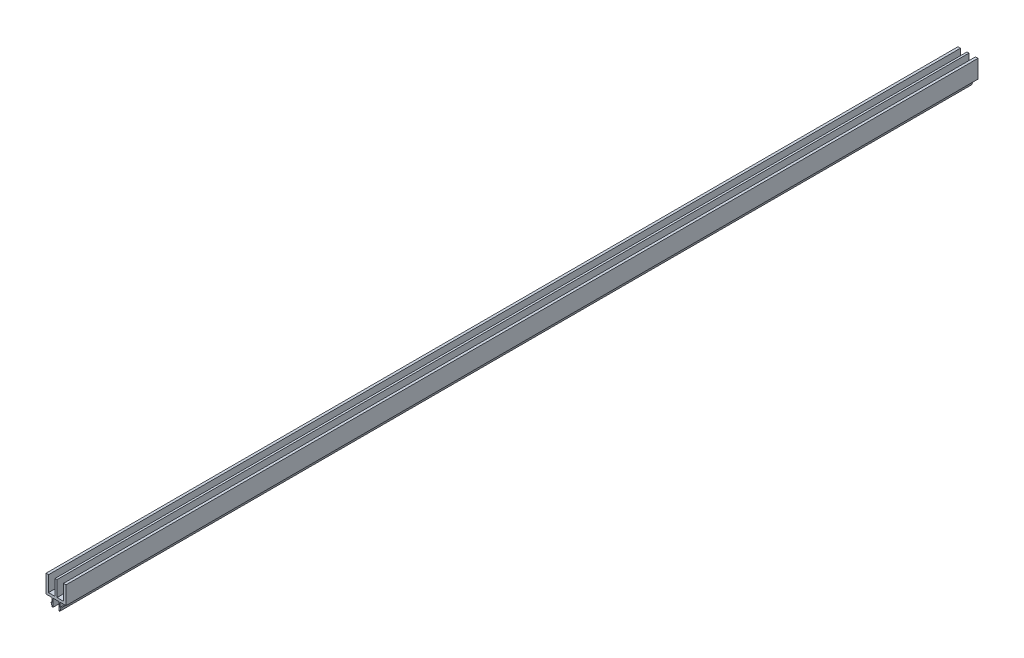
ISO-10303-21;
HEADER;
FILE_DESCRIPTION(('STEP AP214'),'2;1');
FILE_NAME('part.step','',(''),(''),'','','');
FILE_SCHEMA(('AUTOMOTIVE_DESIGN { 1 0 10303 214 1 1 1 1 }'));
ENDSEC;
DATA;
#1=APPLICATION_CONTEXT('core data for automotive mechanical design processes');
#2=APPLICATION_PROTOCOL_DEFINITION('international standard','automotive_design',2000,#1);
#3=PRODUCT_CONTEXT('',#1,'mechanical');
#4=PRODUCT('Part','Part','',(#3));
#5=PRODUCT_RELATED_PRODUCT_CATEGORY('part','',(#4));
#6=PRODUCT_DEFINITION_FORMATION('','',#4);
#7=PRODUCT_DEFINITION_CONTEXT('part definition',#1,'design');
#8=PRODUCT_DEFINITION('design','',#6,#7);
#9=PRODUCT_DEFINITION_SHAPE('','',#8);
#10=(LENGTH_UNIT() NAMED_UNIT(*) SI_UNIT(.MILLI.,.METRE.));
#11=(NAMED_UNIT(*) PLANE_ANGLE_UNIT() SI_UNIT($,.RADIAN.));
#12=(NAMED_UNIT(*) SI_UNIT($,.STERADIAN.) SOLID_ANGLE_UNIT());
#13=UNCERTAINTY_MEASURE_WITH_UNIT(LENGTH_MEASURE(1.E-05),#10,'distance_accuracy_value','');
#14=(GEOMETRIC_REPRESENTATION_CONTEXT(3) GLOBAL_UNCERTAINTY_ASSIGNED_CONTEXT((#13)) GLOBAL_UNIT_ASSIGNED_CONTEXT((#10,
#11,#12)) REPRESENTATION_CONTEXT('',''));
#15=CARTESIAN_POINT('',(0.,0.,0.));
#16=DIRECTION('',(0.,0.,1.));
#17=DIRECTION('',(1.,0.,0.));
#18=AXIS2_PLACEMENT_3D('',#15,#16,#17);
#19=CARTESIAN_POINT('',(-1.,17.9999999975,-860.));
#20=DIRECTION('',(-1.,0.,0.));
#21=DIRECTION('',(0.,-1.,0.));
#22=AXIS2_PLACEMENT_3D('',#19,#20,#21);
#23=PLANE('',#22);
#24=DIRECTION('',(0.,-1.,0.));
#25=VECTOR('',#24,1.);
#26=CARTESIAN_POINT('',(-1.,17.9999999975,50.));
#27=LINE('',#26,#25);
#28=CARTESIAN_POINT('',(-1.,17.9999999975,50.));
#29=VERTEX_POINT('',#28);
#30=CARTESIAN_POINT('',(-1.,2.4999999995,50.));
#31=VERTEX_POINT('',#30);
#32=EDGE_CURVE('E226',#29,#31,#27,.T.);
#33=ORIENTED_EDGE('',*,*,#32,.F.);
#34=DIRECTION('',(0.,0.,1.));
#35=VECTOR('',#34,1.);
#36=CARTESIAN_POINT('',(-1.,17.9999999975,-860.));
#37=LINE('',#36,#35);
#38=CARTESIAN_POINT('',(-1.,17.9999999975,-860.));
#39=VERTEX_POINT('',#38);
#40=EDGE_CURVE('E11',#39,#29,#37,.T.);
#41=ORIENTED_EDGE('',*,*,#40,.F.);
#42=DIRECTION('',(0.,-1.,0.));
#43=VECTOR('',#42,1.);
#44=CARTESIAN_POINT('',(-1.,17.9999999975,-860.));
#45=LINE('',#44,#43);
#46=CARTESIAN_POINT('',(-1.,2.4999999995,-860.));
#47=VERTEX_POINT('',#46);
#48=EDGE_CURVE('E294',#39,#47,#45,.T.);
#49=ORIENTED_EDGE('',*,*,#48,.T.);
#50=DIRECTION('',(0.,0.,1.));
#51=VECTOR('',#50,1.);
#52=CARTESIAN_POINT('',(-1.,2.4999999995,-860.));
#53=LINE('',#52,#51);
#54=EDGE_CURVE('E36',#47,#31,#53,.T.);
#55=ORIENTED_EDGE('',*,*,#54,.T.);
#56=EDGE_LOOP('',(#33,#41,#49,#55));
#57=FACE_BOUND('',#56,.T.);
#58=ADVANCED_FACE('F33',(#57),#23,.T.);
#59=CARTESIAN_POINT('',(0.999999999999998,17.9999999975,-860.));
#60=DIRECTION('',(0.,1.,0.));
#61=DIRECTION('',(0.,0.,1.));
#62=AXIS2_PLACEMENT_3D('',#59,#60,#61);
#63=PLANE('',#62);
#64=DIRECTION('',(-1.,0.,0.));
#65=VECTOR('',#64,1.);
#66=CARTESIAN_POINT('',(0.999999999999998,17.9999999975,50.));
#67=LINE('',#66,#65);
#68=CARTESIAN_POINT('',(0.999999999999998,17.9999999975,50.));
#69=VERTEX_POINT('',#68);
#70=EDGE_CURVE('E292',#69,#29,#67,.T.);
#71=ORIENTED_EDGE('',*,*,#70,.F.);
#72=DIRECTION('',(0.,0.,1.));
#73=VECTOR('',#72,1.);
#74=CARTESIAN_POINT('',(0.999999999999998,17.9999999975,-860.));
#75=LINE('',#74,#73);
#76=CARTESIAN_POINT('',(0.999999999999998,17.9999999975,-860.));
#77=VERTEX_POINT('',#76);
#78=EDGE_CURVE('E42',#77,#69,#75,.T.);
#79=ORIENTED_EDGE('',*,*,#78,.F.);
#80=DIRECTION('',(-1.,0.,0.));
#81=VECTOR('',#80,1.);
#82=CARTESIAN_POINT('',(0.999999999999998,17.9999999975,-860.));
#83=LINE('',#82,#81);
#84=EDGE_CURVE('E216',#77,#39,#83,.T.);
#85=ORIENTED_EDGE('',*,*,#84,.T.);
#86=ORIENTED_EDGE('',*,*,#40,.T.);
#87=EDGE_LOOP('',(#71,#79,#85,#86));
#88=FACE_BOUND('',#87,.T.);
#89=ADVANCED_FACE('F338',(#88),#63,.T.);
#90=CARTESIAN_POINT('',(0.999999999999998,2.4999999995,-860.));
#91=DIRECTION('',(1.,0.,0.));
#92=DIRECTION('',(0.,0.,-1.));
#93=AXIS2_PLACEMENT_3D('',#90,#91,#92);
#94=PLANE('',#93);
#95=DIRECTION('',(0.,1.,0.));
#96=VECTOR('',#95,1.);
#97=CARTESIAN_POINT('',(0.999999999999998,2.4999999995,50.));
#98=LINE('',#97,#96);
#99=CARTESIAN_POINT('',(0.999999999999998,2.4999999995,50.));
#100=VERTEX_POINT('',#99);
#101=EDGE_CURVE('E203',#100,#69,#98,.T.);
#102=ORIENTED_EDGE('',*,*,#101,.F.);
#103=DIRECTION('',(0.,0.,1.));
#104=VECTOR('',#103,1.);
#105=CARTESIAN_POINT('',(0.999999999999998,2.4999999995,-860.));
#106=LINE('',#105,#104);
#107=CARTESIAN_POINT('',(0.999999999999998,2.4999999995,-860.));
#108=VERTEX_POINT('',#107);
#109=EDGE_CURVE('E198',#108,#100,#106,.T.);
#110=ORIENTED_EDGE('',*,*,#109,.F.);
#111=DIRECTION('',(0.,1.,0.));
#112=VECTOR('',#111,1.);
#113=CARTESIAN_POINT('',(0.999999999999998,2.4999999995,-860.));
#114=LINE('',#113,#112);
#115=EDGE_CURVE('E201',#108,#77,#114,.T.);
#116=ORIENTED_EDGE('',*,*,#115,.T.);
#117=ORIENTED_EDGE('',*,*,#78,.T.);
#118=EDGE_LOOP('',(#102,#110,#116,#117));
#119=FACE_BOUND('',#118,.T.);
#120=ADVANCED_FACE('F200',(#119),#94,.T.);
#121=CARTESIAN_POINT('',(7.5,2.4999999995,-860.));
#122=DIRECTION('',(0.,1.,0.));
#123=DIRECTION('',(-1.,0.,0.));
#124=AXIS2_PLACEMENT_3D('',#121,#122,#123);
#125=PLANE('',#124);
#126=DIRECTION('',(-1.,0.,0.));
#127=VECTOR('',#126,1.);
#128=CARTESIAN_POINT('',(7.5,2.4999999995,50.));
#129=LINE('',#128,#127);
#130=CARTESIAN_POINT('',(7.5,2.4999999995,50.));
#131=VERTEX_POINT('',#130);
#132=EDGE_CURVE('E289',#131,#100,#129,.T.);
#133=ORIENTED_EDGE('',*,*,#132,.F.);
#134=DIRECTION('',(0.,0.,1.));
#135=VECTOR('',#134,1.);
#136=CARTESIAN_POINT('',(7.5,2.4999999995,-860.));
#137=LINE('',#136,#135);
#138=CARTESIAN_POINT('',(7.5,2.4999999995,-860.));
#139=VERTEX_POINT('',#138);
#140=EDGE_CURVE('E208',#139,#131,#137,.T.);
#141=ORIENTED_EDGE('',*,*,#140,.F.);
#142=DIRECTION('',(-1.,0.,0.));
#143=VECTOR('',#142,1.);
#144=CARTESIAN_POINT('',(7.5,2.4999999995,-860.));
#145=LINE('',#144,#143);
#146=EDGE_CURVE('E214',#139,#108,#145,.T.);
#147=ORIENTED_EDGE('',*,*,#146,.T.);
#148=ORIENTED_EDGE('',*,*,#109,.T.);
#149=EDGE_LOOP('',(#133,#141,#147,#148));
#150=FACE_BOUND('',#149,.T.);
#151=ADVANCED_FACE('F218',(#150),#125,.T.);
#152=CARTESIAN_POINT('',(7.5,17.9999999975,-860.));
#153=DIRECTION('',(-1.,0.,0.));
#154=DIRECTION('',(0.,-1.,0.));
#155=AXIS2_PLACEMENT_3D('',#152,#153,#154);
#156=PLANE('',#155);
#157=DIRECTION('',(0.,-1.,0.));
#158=VECTOR('',#157,1.);
#159=CARTESIAN_POINT('',(7.5,17.9999999975,50.));
#160=LINE('',#159,#158);
#161=CARTESIAN_POINT('',(7.5,17.9999999975,50.));
#162=VERTEX_POINT('',#161);
#163=EDGE_CURVE('E286',#162,#131,#160,.T.);
#164=ORIENTED_EDGE('',*,*,#163,.F.);
#165=DIRECTION('',(0.,0.,1.));
#166=VECTOR('',#165,1.);
#167=CARTESIAN_POINT('',(7.5,17.9999999975,-860.));
#168=LINE('',#167,#166);
#169=CARTESIAN_POINT('',(7.5,17.9999999975,-860.));
#170=VERTEX_POINT('',#169);
#171=EDGE_CURVE('E298',#170,#162,#168,.T.);
#172=ORIENTED_EDGE('',*,*,#171,.F.);
#173=DIRECTION('',(0.,-1.,0.));
#174=VECTOR('',#173,1.);
#175=CARTESIAN_POINT('',(7.5,17.9999999975,-860.));
#176=LINE('',#175,#174);
#177=EDGE_CURVE('E219',#170,#139,#176,.T.);
#178=ORIENTED_EDGE('',*,*,#177,.T.);
#179=ORIENTED_EDGE('',*,*,#140,.T.);
#180=EDGE_LOOP('',(#164,#172,#178,#179));
#181=FACE_BOUND('',#180,.T.);
#182=ADVANCED_FACE('F351',(#181),#156,.T.);
#183=CARTESIAN_POINT('',(10.,17.9999999975,-860.));
#184=DIRECTION('',(0.,1.,0.));
#185=DIRECTION('',(0.,0.,1.));
#186=AXIS2_PLACEMENT_3D('',#183,#184,#185);
#187=PLANE('',#186);
#188=DIRECTION('',(-1.,0.,0.));
#189=VECTOR('',#188,1.);
#190=CARTESIAN_POINT('',(10.,17.9999999975,50.));
#191=LINE('',#190,#189);
#192=CARTESIAN_POINT('',(10.,17.9999999975,50.));
#193=VERTEX_POINT('',#192);
#194=EDGE_CURVE('E283',#193,#162,#191,.T.);
#195=ORIENTED_EDGE('',*,*,#194,.F.);
#196=DIRECTION('',(0.,0.,1.));
#197=VECTOR('',#196,1.);
#198=CARTESIAN_POINT('',(10.,17.9999999975,-860.));
#199=LINE('',#198,#197);
#200=CARTESIAN_POINT('',(10.,17.9999999975,-860.));
#201=VERTEX_POINT('',#200);
#202=EDGE_CURVE('E300',#201,#193,#199,.T.);
#203=ORIENTED_EDGE('',*,*,#202,.F.);
#204=DIRECTION('',(-1.,0.,0.));
#205=VECTOR('',#204,1.);
#206=CARTESIAN_POINT('',(10.,17.9999999975,-860.));
#207=LINE('',#206,#205);
#208=EDGE_CURVE('E221',#201,#170,#207,.T.);
#209=ORIENTED_EDGE('',*,*,#208,.T.);
#210=ORIENTED_EDGE('',*,*,#171,.T.);
#211=EDGE_LOOP('',(#195,#203,#209,#210));
#212=FACE_BOUND('',#211,.T.);
#213=ADVANCED_FACE('F354',(#212),#187,.T.);
#214=CARTESIAN_POINT('',(10.,-4.99999828349541E-10,-860.));
#215=DIRECTION('',(1.,0.,0.));
#216=DIRECTION('',(0.,0.,-1.));
#217=AXIS2_PLACEMENT_3D('',#214,#215,#216);
#218=PLANE('',#217);
#219=DIRECTION('',(0.,1.,0.));
#220=VECTOR('',#219,1.);
#221=CARTESIAN_POINT('',(10.,-4.99999828349541E-10,50.));
#222=LINE('',#221,#220);
#223=CARTESIAN_POINT('',(10.,-4.99999828349541E-10,50.));
#224=VERTEX_POINT('',#223);
#225=EDGE_CURVE('E280',#224,#193,#222,.T.);
#226=ORIENTED_EDGE('',*,*,#225,.F.);
#227=DIRECTION('',(0.,0.,1.));
#228=VECTOR('',#227,1.);
#229=CARTESIAN_POINT('',(10.,-4.99999828349541E-10,-860.));
#230=LINE('',#229,#228);
#231=CARTESIAN_POINT('',(10.,-4.99999828349541E-10,-860.));
#232=VERTEX_POINT('',#231);
#233=EDGE_CURVE('E302',#232,#224,#230,.T.);
#234=ORIENTED_EDGE('',*,*,#233,.F.);
#235=DIRECTION('',(0.,1.,0.));
#236=VECTOR('',#235,1.);
#237=CARTESIAN_POINT('',(10.,-4.99999828349541E-10,-860.));
#238=LINE('',#237,#236);
#239=EDGE_CURVE('E644',#232,#201,#238,.T.);
#240=ORIENTED_EDGE('',*,*,#239,.T.);
#241=ORIENTED_EDGE('',*,*,#202,.T.);
#242=EDGE_LOOP('',(#226,#234,#240,#241));
#243=FACE_BOUND('',#242,.T.);
#244=ADVANCED_FACE('F358',(#243),#218,.T.);
#245=CARTESIAN_POINT('',(4.,-4.99999998002099E-10,-860.));
#246=DIRECTION('',(0.,-1.,0.));
#247=DIRECTION('',(1.,0.,0.));
#248=AXIS2_PLACEMENT_3D('',#245,#246,#247);
#249=PLANE('',#248);
#250=DIRECTION('',(1.,0.,0.));
#251=VECTOR('',#250,1.);
#252=CARTESIAN_POINT('',(4.,-4.99999998002099E-10,50.));
#253=LINE('',#252,#251);
#254=CARTESIAN_POINT('',(4.,-4.99999998002099E-10,50.));
#255=VERTEX_POINT('',#254);
#256=EDGE_CURVE('E277',#255,#224,#253,.T.);
#257=ORIENTED_EDGE('',*,*,#256,.F.);
#258=DIRECTION('',(0.,0.,1.));
#259=VECTOR('',#258,1.);
#260=CARTESIAN_POINT('',(4.,-4.99999998002099E-10,-860.));
#261=LINE('',#260,#259);
#262=CARTESIAN_POINT('',(4.,-4.99999998002099E-10,-860.));
#263=VERTEX_POINT('',#262);
#264=EDGE_CURVE('E304',#263,#255,#261,.T.);
#265=ORIENTED_EDGE('',*,*,#264,.F.);
#266=DIRECTION('',(1.,0.,0.));
#267=VECTOR('',#266,1.);
#268=CARTESIAN_POINT('',(4.,-4.99999998002099E-10,-860.));
#269=LINE('',#268,#267);
#270=EDGE_CURVE('E648',#263,#232,#269,.T.);
#271=ORIENTED_EDGE('',*,*,#270,.T.);
#272=ORIENTED_EDGE('',*,*,#233,.T.);
#273=EDGE_LOOP('',(#257,#265,#271,#272));
#274=FACE_BOUND('',#273,.T.);
#275=ADVANCED_FACE('F362',(#274),#249,.T.);
#276=CARTESIAN_POINT('',(4.,-4.5,-860.));
#277=DIRECTION('',(1.,0.,0.));
#278=DIRECTION('',(0.,0.,-1.));
#279=AXIS2_PLACEMENT_3D('',#276,#277,#278);
#280=PLANE('',#279);
#281=DIRECTION('',(0.,1.,0.));
#282=VECTOR('',#281,1.);
#283=CARTESIAN_POINT('',(4.,-4.5,50.));
#284=LINE('',#283,#282);
#285=CARTESIAN_POINT('',(4.,-4.5,50.));
#286=VERTEX_POINT('',#285);
#287=EDGE_CURVE('E274',#286,#255,#284,.T.);
#288=ORIENTED_EDGE('',*,*,#287,.F.);
#289=DIRECTION('',(0.,0.,1.));
#290=VECTOR('',#289,1.);
#291=CARTESIAN_POINT('',(4.,-4.5,-860.));
#292=LINE('',#291,#290);
#293=CARTESIAN_POINT('',(4.,-4.5,-860.));
#294=VERTEX_POINT('',#293);
#295=EDGE_CURVE('E306',#294,#286,#292,.T.);
#296=ORIENTED_EDGE('',*,*,#295,.F.);
#297=DIRECTION('',(0.,1.,0.));
#298=VECTOR('',#297,1.);
#299=CARTESIAN_POINT('',(4.,-4.5,-860.));
#300=LINE('',#299,#298);
#301=EDGE_CURVE('E637',#294,#263,#300,.T.);
#302=ORIENTED_EDGE('',*,*,#301,.T.);
#303=ORIENTED_EDGE('',*,*,#264,.T.);
#304=EDGE_LOOP('',(#288,#296,#302,#303));
#305=FACE_BOUND('',#304,.T.);
#306=ADVANCED_FACE('F366',(#305),#280,.T.);
#307=CARTESIAN_POINT('',(5.,-4.5,-860.));
#308=DIRECTION('',(0.,1.,0.));
#309=DIRECTION('',(0.,0.,1.));
#310=AXIS2_PLACEMENT_3D('',#307,#308,#309);
#311=PLANE('',#310);
#312=DIRECTION('',(-1.,0.,0.));
#313=VECTOR('',#312,1.);
#314=CARTESIAN_POINT('',(5.,-4.5,50.));
#315=LINE('',#314,#313);
#316=CARTESIAN_POINT('',(5.,-4.5,50.));
#317=VERTEX_POINT('',#316);
#318=EDGE_CURVE('E271',#317,#286,#315,.T.);
#319=ORIENTED_EDGE('',*,*,#318,.F.);
#320=DIRECTION('',(0.,0.,1.));
#321=VECTOR('',#320,1.);
#322=CARTESIAN_POINT('',(5.,-4.5,-860.));
#323=LINE('',#322,#321);
#324=CARTESIAN_POINT('',(5.,-4.5,-860.));
#325=VERTEX_POINT('',#324);
#326=EDGE_CURVE('E308',#325,#317,#323,.T.);
#327=ORIENTED_EDGE('',*,*,#326,.F.);
#328=DIRECTION('',(-1.,0.,0.));
#329=VECTOR('',#328,1.);
#330=CARTESIAN_POINT('',(5.,-4.5,-860.));
#331=LINE('',#330,#329);
#332=EDGE_CURVE('E633',#325,#294,#331,.T.);
#333=ORIENTED_EDGE('',*,*,#332,.T.);
#334=ORIENTED_EDGE('',*,*,#295,.T.);
#335=EDGE_LOOP('',(#319,#327,#333,#334));
#336=FACE_BOUND('',#335,.T.);
#337=ADVANCED_FACE('F370',(#336),#311,.T.);
#338=CARTESIAN_POINT('',(3.75,-8.,-860.));
#339=DIRECTION('',(0.941741911594837,-0.336336396998156,0.));
#340=DIRECTION('',(0.336336396998157,0.941741911594838,0.));
#341=AXIS2_PLACEMENT_3D('',#338,#339,#340);
#342=PLANE('',#341);
#343=DIRECTION('',(0.336336396998157,0.941741911594837,0.));
#344=VECTOR('',#343,1.);
#345=CARTESIAN_POINT('',(3.75,-8.,50.));
#346=LINE('',#345,#344);
#347=CARTESIAN_POINT('',(3.75,-8.,50.));
#348=VERTEX_POINT('',#347);
#349=EDGE_CURVE('E268',#348,#317,#346,.T.);
#350=ORIENTED_EDGE('',*,*,#349,.F.);
#351=DIRECTION('',(0.,0.,1.));
#352=VECTOR('',#351,1.);
#353=CARTESIAN_POINT('',(3.75,-8.,-860.));
#354=LINE('',#353,#352);
#355=CARTESIAN_POINT('',(3.75,-8.,-860.));
#356=VERTEX_POINT('',#355);
#357=EDGE_CURVE('E310',#356,#348,#354,.T.);
#358=ORIENTED_EDGE('',*,*,#357,.F.);
#359=DIRECTION('',(0.336336396998157,0.941741911594837,0.));
#360=VECTOR('',#359,1.);
#361=CARTESIAN_POINT('',(3.75,-8.,-860.));
#362=LINE('',#361,#360);
#363=EDGE_CURVE('E654',#356,#325,#362,.T.);
#364=ORIENTED_EDGE('',*,*,#363,.T.);
#365=ORIENTED_EDGE('',*,*,#326,.T.);
#366=EDGE_LOOP('',(#350,#358,#364,#365));
#367=FACE_BOUND('',#366,.T.);
#368=ADVANCED_FACE('F374',(#367),#342,.T.);
#369=CARTESIAN_POINT('',(3.,-8.,-860.));
#370=DIRECTION('',(0.,-1.,0.));
#371=DIRECTION('',(0.,0.,-1.));
#372=AXIS2_PLACEMENT_3D('',#369,#370,#371);
#373=PLANE('',#372);
#374=DIRECTION('',(1.,0.,0.));
#375=VECTOR('',#374,1.);
#376=CARTESIAN_POINT('',(3.,-8.,50.));
#377=LINE('',#376,#375);
#378=CARTESIAN_POINT('',(3.,-8.,50.));
#379=VERTEX_POINT('',#378);
#380=EDGE_CURVE('E265',#379,#348,#377,.T.);
#381=ORIENTED_EDGE('',*,*,#380,.F.);
#382=DIRECTION('',(0.,0.,1.));
#383=VECTOR('',#382,1.);
#384=CARTESIAN_POINT('',(3.,-8.,-860.));
#385=LINE('',#384,#383);
#386=CARTESIAN_POINT('',(3.,-8.,-860.));
#387=VERTEX_POINT('',#386);
#388=EDGE_CURVE('E312',#387,#379,#385,.T.);
#389=ORIENTED_EDGE('',*,*,#388,.F.);
#390=DIRECTION('',(1.,0.,0.));
#391=VECTOR('',#390,1.);
#392=CARTESIAN_POINT('',(3.,-8.,-860.));
#393=LINE('',#392,#391);
#394=EDGE_CURVE('E626',#387,#356,#393,.T.);
#395=ORIENTED_EDGE('',*,*,#394,.T.);
#396=ORIENTED_EDGE('',*,*,#357,.T.);
#397=EDGE_LOOP('',(#381,#389,#395,#396));
#398=FACE_BOUND('',#397,.T.);
#399=ADVANCED_FACE('F378',(#398),#373,.T.);
#400=CARTESIAN_POINT('',(3.,-4.9999985194348E-10,-860.));
#401=DIRECTION('',(-1.,0.,0.));
#402=DIRECTION('',(0.,0.,1.));
#403=AXIS2_PLACEMENT_3D('',#400,#401,#402);
#404=PLANE('',#403);
#405=DIRECTION('',(0.,-1.,0.));
#406=VECTOR('',#405,1.);
#407=CARTESIAN_POINT('',(3.,-4.9999985194348E-10,50.));
#408=LINE('',#407,#406);
#409=CARTESIAN_POINT('',(3.,-4.9999985194348E-10,50.));
#410=VERTEX_POINT('',#409);
#411=EDGE_CURVE('E262',#410,#379,#408,.T.);
#412=ORIENTED_EDGE('',*,*,#411,.F.);
#413=DIRECTION('',(0.,0.,1.));
#414=VECTOR('',#413,1.);
#415=CARTESIAN_POINT('',(3.,-4.9999985194348E-10,-860.));
#416=LINE('',#415,#414);
#417=CARTESIAN_POINT('',(3.,-4.9999985194348E-10,-860.));
#418=VERTEX_POINT('',#417);
#419=EDGE_CURVE('E314',#418,#410,#416,.T.);
#420=ORIENTED_EDGE('',*,*,#419,.F.);
#421=DIRECTION('',(0.,-1.,0.));
#422=VECTOR('',#421,1.);
#423=CARTESIAN_POINT('',(3.,-4.9999985194348E-10,-860.));
#424=LINE('',#423,#422);
#425=EDGE_CURVE('E622',#418,#387,#424,.T.);
#426=ORIENTED_EDGE('',*,*,#425,.T.);
#427=ORIENTED_EDGE('',*,*,#388,.T.);
#428=EDGE_LOOP('',(#412,#420,#426,#427));
#429=FACE_BOUND('',#428,.T.);
#430=ADVANCED_FACE('F382',(#429),#404,.T.);
#431=CARTESIAN_POINT('',(-3.,-4.99999455901012E-10,-860.));
#432=DIRECTION('',(0.,-1.,0.));
#433=DIRECTION('',(1.,0.,0.));
#434=AXIS2_PLACEMENT_3D('',#431,#432,#433);
#435=PLANE('',#434);
#436=DIRECTION('',(1.,0.,0.));
#437=VECTOR('',#436,1.);
#438=CARTESIAN_POINT('',(-3.,-4.99999455901012E-10,50.));
#439=LINE('',#438,#437);
#440=CARTESIAN_POINT('',(-3.,-4.99999455901012E-10,50.));
#441=VERTEX_POINT('',#440);
#442=EDGE_CURVE('E259',#441,#410,#439,.T.);
#443=ORIENTED_EDGE('',*,*,#442,.F.);
#444=DIRECTION('',(0.,0.,1.));
#445=VECTOR('',#444,1.);
#446=CARTESIAN_POINT('',(-3.,-4.99999455901012E-10,-860.));
#447=LINE('',#446,#445);
#448=CARTESIAN_POINT('',(-3.,-4.99999455901012E-10,-860.));
#449=VERTEX_POINT('',#448);
#450=EDGE_CURVE('E316',#449,#441,#447,.T.);
#451=ORIENTED_EDGE('',*,*,#450,.F.);
#452=DIRECTION('',(1.,0.,0.));
#453=VECTOR('',#452,1.);
#454=CARTESIAN_POINT('',(-3.,-4.99999455901012E-10,-860.));
#455=LINE('',#454,#453);
#456=EDGE_CURVE('E658',#449,#418,#455,.T.);
#457=ORIENTED_EDGE('',*,*,#456,.T.);
#458=ORIENTED_EDGE('',*,*,#419,.T.);
#459=EDGE_LOOP('',(#443,#451,#457,#458));
#460=FACE_BOUND('',#459,.T.);
#461=ADVANCED_FACE('F386',(#460),#435,.T.);
#462=CARTESIAN_POINT('',(-3.,-8.,-860.));
#463=DIRECTION('',(1.,0.,0.));
#464=DIRECTION('',(0.,0.,-1.));
#465=AXIS2_PLACEMENT_3D('',#462,#463,#464);
#466=PLANE('',#465);
#467=DIRECTION('',(0.,1.,0.));
#468=VECTOR('',#467,1.);
#469=CARTESIAN_POINT('',(-3.,-8.,50.));
#470=LINE('',#469,#468);
#471=CARTESIAN_POINT('',(-3.,-8.,50.));
#472=VERTEX_POINT('',#471);
#473=EDGE_CURVE('E256',#472,#441,#470,.T.);
#474=ORIENTED_EDGE('',*,*,#473,.F.);
#475=DIRECTION('',(0.,0.,1.));
#476=VECTOR('',#475,1.);
#477=CARTESIAN_POINT('',(-3.,-8.,-860.));
#478=LINE('',#477,#476);
#479=CARTESIAN_POINT('',(-3.,-8.,-860.));
#480=VERTEX_POINT('',#479);
#481=EDGE_CURVE('E318',#480,#472,#478,.T.);
#482=ORIENTED_EDGE('',*,*,#481,.F.);
#483=DIRECTION('',(0.,1.,0.));
#484=VECTOR('',#483,1.);
#485=CARTESIAN_POINT('',(-3.,-8.,-860.));
#486=LINE('',#485,#484);
#487=EDGE_CURVE('E615',#480,#449,#486,.T.);
#488=ORIENTED_EDGE('',*,*,#487,.T.);
#489=ORIENTED_EDGE('',*,*,#450,.T.);
#490=EDGE_LOOP('',(#474,#482,#488,#489));
#491=FACE_BOUND('',#490,.T.);
#492=ADVANCED_FACE('F390',(#491),#466,.T.);
#493=CARTESIAN_POINT('',(-3.75,-8.,-860.));
#494=DIRECTION('',(0.,-1.,0.));
#495=DIRECTION('',(0.,0.,-1.));
#496=AXIS2_PLACEMENT_3D('',#493,#494,#495);
#497=PLANE('',#496);
#498=DIRECTION('',(1.,0.,0.));
#499=VECTOR('',#498,1.);
#500=CARTESIAN_POINT('',(-3.75,-8.,50.));
#501=LINE('',#500,#499);
#502=CARTESIAN_POINT('',(-3.75,-8.,50.));
#503=VERTEX_POINT('',#502);
#504=EDGE_CURVE('E253',#503,#472,#501,.T.);
#505=ORIENTED_EDGE('',*,*,#504,.F.);
#506=DIRECTION('',(0.,0.,1.));
#507=VECTOR('',#506,1.);
#508=CARTESIAN_POINT('',(-3.75,-8.,-860.));
#509=LINE('',#508,#507);
#510=CARTESIAN_POINT('',(-3.75,-8.,-860.));
#511=VERTEX_POINT('',#510);
#512=EDGE_CURVE('E320',#511,#503,#509,.T.);
#513=ORIENTED_EDGE('',*,*,#512,.F.);
#514=DIRECTION('',(1.,0.,0.));
#515=VECTOR('',#514,1.);
#516=CARTESIAN_POINT('',(-3.75,-8.,-860.));
#517=LINE('',#516,#515);
#518=EDGE_CURVE('E611',#511,#480,#517,.T.);
#519=ORIENTED_EDGE('',*,*,#518,.T.);
#520=ORIENTED_EDGE('',*,*,#481,.T.);
#521=EDGE_LOOP('',(#505,#513,#519,#520));
#522=FACE_BOUND('',#521,.T.);
#523=ADVANCED_FACE('F394',(#522),#497,.T.);
#524=CARTESIAN_POINT('',(-5.,-4.5,-860.));
#525=DIRECTION('',(-0.941741911594837,-0.336336396998156,0.));
#526=DIRECTION('',(0.336336396998156,-0.941741911594837,0.));
#527=AXIS2_PLACEMENT_3D('',#524,#525,#526);
#528=PLANE('',#527);
#529=DIRECTION('',(0.336336396998156,-0.941741911594837,0.));
#530=VECTOR('',#529,1.);
#531=CARTESIAN_POINT('',(-5.,-4.5,50.));
#532=LINE('',#531,#530);
#533=CARTESIAN_POINT('',(-5.,-4.5,50.));
#534=VERTEX_POINT('',#533);
#535=EDGE_CURVE('E250',#534,#503,#532,.T.);
#536=ORIENTED_EDGE('',*,*,#535,.F.);
#537=DIRECTION('',(0.,0.,1.));
#538=VECTOR('',#537,1.);
#539=CARTESIAN_POINT('',(-5.,-4.5,-860.));
#540=LINE('',#539,#538);
#541=CARTESIAN_POINT('',(-5.,-4.5,-860.));
#542=VERTEX_POINT('',#541);
#543=EDGE_CURVE('E322',#542,#534,#540,.T.);
#544=ORIENTED_EDGE('',*,*,#543,.F.);
#545=DIRECTION('',(0.336336396998156,-0.941741911594837,0.));
#546=VECTOR('',#545,1.);
#547=CARTESIAN_POINT('',(-5.,-4.5,-860.));
#548=LINE('',#547,#546);
#549=EDGE_CURVE('E662',#542,#511,#548,.T.);
#550=ORIENTED_EDGE('',*,*,#549,.T.);
#551=ORIENTED_EDGE('',*,*,#512,.T.);
#552=EDGE_LOOP('',(#536,#544,#550,#551));
#553=FACE_BOUND('',#552,.T.);
#554=ADVANCED_FACE('F398',(#553),#528,.T.);
#555=CARTESIAN_POINT('',(-4.,-4.5,-860.));
#556=DIRECTION('',(0.,1.,0.));
#557=DIRECTION('',(0.,0.,1.));
#558=AXIS2_PLACEMENT_3D('',#555,#556,#557);
#559=PLANE('',#558);
#560=DIRECTION('',(-1.,0.,0.));
#561=VECTOR('',#560,1.);
#562=CARTESIAN_POINT('',(-4.,-4.5,50.));
#563=LINE('',#562,#561);
#564=CARTESIAN_POINT('',(-4.,-4.5,50.));
#565=VERTEX_POINT('',#564);
#566=EDGE_CURVE('E247',#565,#534,#563,.T.);
#567=ORIENTED_EDGE('',*,*,#566,.F.);
#568=DIRECTION('',(0.,0.,1.));
#569=VECTOR('',#568,1.);
#570=CARTESIAN_POINT('',(-4.,-4.5,-860.));
#571=LINE('',#570,#569);
#572=CARTESIAN_POINT('',(-4.,-4.5,-860.));
#573=VERTEX_POINT('',#572);
#574=EDGE_CURVE('E324',#573,#565,#571,.T.);
#575=ORIENTED_EDGE('',*,*,#574,.F.);
#576=DIRECTION('',(-1.,0.,0.));
#577=VECTOR('',#576,1.);
#578=CARTESIAN_POINT('',(-4.,-4.5,-860.));
#579=LINE('',#578,#577);
#580=EDGE_CURVE('E604',#573,#542,#579,.T.);
#581=ORIENTED_EDGE('',*,*,#580,.T.);
#582=ORIENTED_EDGE('',*,*,#543,.T.);
#583=EDGE_LOOP('',(#567,#575,#581,#582));
#584=FACE_BOUND('',#583,.T.);
#585=ADVANCED_FACE('F402',(#584),#559,.T.);
#586=CARTESIAN_POINT('',(-4.,-4.9999985194348E-10,-860.));
#587=DIRECTION('',(-1.,0.,0.));
#588=DIRECTION('',(0.,0.,1.));
#589=AXIS2_PLACEMENT_3D('',#586,#587,#588);
#590=PLANE('',#589);
#591=DIRECTION('',(0.,-1.,0.));
#592=VECTOR('',#591,1.);
#593=CARTESIAN_POINT('',(-4.,-4.9999985194348E-10,50.));
#594=LINE('',#593,#592);
#595=CARTESIAN_POINT('',(-4.,-4.9999985194348E-10,50.));
#596=VERTEX_POINT('',#595);
#597=EDGE_CURVE('E244',#596,#565,#594,.T.);
#598=ORIENTED_EDGE('',*,*,#597,.F.);
#599=DIRECTION('',(0.,0.,1.));
#600=VECTOR('',#599,1.);
#601=CARTESIAN_POINT('',(-4.,-4.9999985194348E-10,-860.));
#602=LINE('',#601,#600);
#603=CARTESIAN_POINT('',(-4.,-4.9999985194348E-10,-860.));
#604=VERTEX_POINT('',#603);
#605=EDGE_CURVE('E326',#604,#596,#602,.T.);
#606=ORIENTED_EDGE('',*,*,#605,.F.);
#607=DIRECTION('',(0.,-1.,0.));
#608=VECTOR('',#607,1.);
#609=CARTESIAN_POINT('',(-4.,-4.9999985194348E-10,-860.));
#610=LINE('',#609,#608);
#611=EDGE_CURVE('E600',#604,#573,#610,.T.);
#612=ORIENTED_EDGE('',*,*,#611,.T.);
#613=ORIENTED_EDGE('',*,*,#574,.T.);
#614=EDGE_LOOP('',(#598,#606,#612,#613));
#615=FACE_BOUND('',#614,.T.);
#616=ADVANCED_FACE('F406',(#615),#590,.T.);
#617=CARTESIAN_POINT('',(-10.,-4.99999719929324E-10,-860.));
#618=DIRECTION('',(0.,-1.,0.));
#619=DIRECTION('',(1.,0.,0.));
#620=AXIS2_PLACEMENT_3D('',#617,#618,#619);
#621=PLANE('',#620);
#622=DIRECTION('',(1.,0.,0.));
#623=VECTOR('',#622,1.);
#624=CARTESIAN_POINT('',(-10.,-4.99999719929324E-10,50.));
#625=LINE('',#624,#623);
#626=CARTESIAN_POINT('',(-10.,-4.99999719929324E-10,50.));
#627=VERTEX_POINT('',#626);
#628=EDGE_CURVE('E241',#627,#596,#625,.T.);
#629=ORIENTED_EDGE('',*,*,#628,.F.);
#630=DIRECTION('',(0.,0.,1.));
#631=VECTOR('',#630,1.);
#632=CARTESIAN_POINT('',(-10.,-4.99999719929324E-10,-860.));
#633=LINE('',#632,#631);
#634=CARTESIAN_POINT('',(-10.,-4.99999719929324E-10,-860.));
#635=VERTEX_POINT('',#634);
#636=EDGE_CURVE('E328',#635,#627,#633,.T.);
#637=ORIENTED_EDGE('',*,*,#636,.F.);
#638=DIRECTION('',(1.,0.,0.));
#639=VECTOR('',#638,1.);
#640=CARTESIAN_POINT('',(-10.,-4.99999719929324E-10,-860.));
#641=LINE('',#640,#639);
#642=EDGE_CURVE('E666',#635,#604,#641,.T.);
#643=ORIENTED_EDGE('',*,*,#642,.T.);
#644=ORIENTED_EDGE('',*,*,#605,.T.);
#645=EDGE_LOOP('',(#629,#637,#643,#644));
#646=FACE_BOUND('',#645,.T.);
#647=ADVANCED_FACE('F410',(#646),#621,.T.);
#648=CARTESIAN_POINT('',(-10.,17.9999999975,-860.));
#649=DIRECTION('',(-1.,0.,0.));
#650=DIRECTION('',(0.,-1.,0.));
#651=AXIS2_PLACEMENT_3D('',#648,#649,#650);
#652=PLANE('',#651);
#653=DIRECTION('',(0.,-1.,0.));
#654=VECTOR('',#653,1.);
#655=CARTESIAN_POINT('',(-10.,17.9999999975,50.));
#656=LINE('',#655,#654);
#657=CARTESIAN_POINT('',(-10.,17.9999999975,50.));
#658=VERTEX_POINT('',#657);
#659=EDGE_CURVE('E238',#658,#627,#656,.T.);
#660=ORIENTED_EDGE('',*,*,#659,.F.);
#661=DIRECTION('',(0.,0.,1.));
#662=VECTOR('',#661,1.);
#663=CARTESIAN_POINT('',(-10.,17.9999999975,-860.));
#664=LINE('',#663,#662);
#665=CARTESIAN_POINT('',(-10.,17.9999999975,-860.));
#666=VERTEX_POINT('',#665);
#667=EDGE_CURVE('E330',#666,#658,#664,.T.);
#668=ORIENTED_EDGE('',*,*,#667,.F.);
#669=DIRECTION('',(0.,-1.,0.));
#670=VECTOR('',#669,1.);
#671=CARTESIAN_POINT('',(-10.,17.9999999975,-860.));
#672=LINE('',#671,#670);
#673=EDGE_CURVE('E593',#666,#635,#672,.T.);
#674=ORIENTED_EDGE('',*,*,#673,.T.);
#675=ORIENTED_EDGE('',*,*,#636,.T.);
#676=EDGE_LOOP('',(#660,#668,#674,#675));
#677=FACE_BOUND('',#676,.T.);
#678=ADVANCED_FACE('F414',(#677),#652,.T.);
#679=CARTESIAN_POINT('',(-7.5,17.9999999975,-860.));
#680=DIRECTION('',(0.,1.,0.));
#681=DIRECTION('',(0.,0.,1.));
#682=AXIS2_PLACEMENT_3D('',#679,#680,#681);
#683=PLANE('',#682);
#684=DIRECTION('',(-1.,0.,0.));
#685=VECTOR('',#684,1.);
#686=CARTESIAN_POINT('',(-7.5,17.9999999975,50.));
#687=LINE('',#686,#685);
#688=CARTESIAN_POINT('',(-7.5,17.9999999975,50.));
#689=VERTEX_POINT('',#688);
#690=EDGE_CURVE('E235',#689,#658,#687,.T.);
#691=ORIENTED_EDGE('',*,*,#690,.F.);
#692=DIRECTION('',(0.,0.,1.));
#693=VECTOR('',#692,1.);
#694=CARTESIAN_POINT('',(-7.5,17.9999999975,-860.));
#695=LINE('',#694,#693);
#696=CARTESIAN_POINT('',(-7.5,17.9999999975,-860.));
#697=VERTEX_POINT('',#696);
#698=EDGE_CURVE('E332',#697,#689,#695,.T.);
#699=ORIENTED_EDGE('',*,*,#698,.F.);
#700=DIRECTION('',(-1.,0.,0.));
#701=VECTOR('',#700,1.);
#702=CARTESIAN_POINT('',(-7.5,17.9999999975,-860.));
#703=LINE('',#702,#701);
#704=EDGE_CURVE('E589',#697,#666,#703,.T.);
#705=ORIENTED_EDGE('',*,*,#704,.T.);
#706=ORIENTED_EDGE('',*,*,#667,.T.);
#707=EDGE_LOOP('',(#691,#699,#705,#706));
#708=FACE_BOUND('',#707,.T.);
#709=ADVANCED_FACE('F418',(#708),#683,.T.);
#710=CARTESIAN_POINT('',(-7.5,2.4999999995,-860.));
#711=DIRECTION('',(1.,0.,0.));
#712=DIRECTION('',(0.,0.,-1.));
#713=AXIS2_PLACEMENT_3D('',#710,#711,#712);
#714=PLANE('',#713);
#715=DIRECTION('',(0.,1.,0.));
#716=VECTOR('',#715,1.);
#717=CARTESIAN_POINT('',(-7.5,2.4999999995,50.));
#718=LINE('',#717,#716);
#719=CARTESIAN_POINT('',(-7.5,2.4999999995,50.));
#720=VERTEX_POINT('',#719);
#721=EDGE_CURVE('E232',#720,#689,#718,.T.);
#722=ORIENTED_EDGE('',*,*,#721,.F.);
#723=DIRECTION('',(0.,0.,1.));
#724=VECTOR('',#723,1.);
#725=CARTESIAN_POINT('',(-7.5,2.4999999995,-860.));
#726=LINE('',#725,#724);
#727=CARTESIAN_POINT('',(-7.5,2.4999999995,-860.));
#728=VERTEX_POINT('',#727);
#729=EDGE_CURVE('E333',#728,#720,#726,.T.);
#730=ORIENTED_EDGE('',*,*,#729,.F.);
#731=DIRECTION('',(0.,1.,0.));
#732=VECTOR('',#731,1.);
#733=CARTESIAN_POINT('',(-7.5,2.4999999995,-860.));
#734=LINE('',#733,#732);
#735=EDGE_CURVE('E670',#728,#697,#734,.T.);
#736=ORIENTED_EDGE('',*,*,#735,.T.);
#737=ORIENTED_EDGE('',*,*,#698,.T.);
#738=EDGE_LOOP('',(#722,#730,#736,#737));
#739=FACE_BOUND('',#738,.T.);
#740=ADVANCED_FACE('F422',(#739),#714,.T.);
#741=CARTESIAN_POINT('',(-1.,2.4999999995,-860.));
#742=DIRECTION('',(0.,1.,0.));
#743=DIRECTION('',(-1.,0.,0.));
#744=AXIS2_PLACEMENT_3D('',#741,#742,#743);
#745=PLANE('',#744);
#746=DIRECTION('',(-1.,0.,0.));
#747=VECTOR('',#746,1.);
#748=CARTESIAN_POINT('',(-1.,2.4999999995,50.));
#749=LINE('',#748,#747);
#750=EDGE_CURVE('E229',#31,#720,#749,.T.);
#751=ORIENTED_EDGE('',*,*,#750,.F.);
#752=ORIENTED_EDGE('',*,*,#54,.F.);
#753=DIRECTION('',(-1.,0.,0.));
#754=VECTOR('',#753,1.);
#755=CARTESIAN_POINT('',(-1.,2.4999999995,-860.));
#756=LINE('',#755,#754);
#757=EDGE_CURVE('E672',#47,#728,#756,.T.);
#758=ORIENTED_EDGE('',*,*,#757,.T.);
#759=ORIENTED_EDGE('',*,*,#729,.T.);
#760=EDGE_LOOP('',(#751,#752,#758,#759));
#761=FACE_BOUND('',#760,.T.);
#762=ADVANCED_FACE('F335',(#761),#745,.T.);
#763=CARTESIAN_POINT('',(0.,0.,-860.));
#764=DIRECTION('',(0.,0.,-1.));
#765=DIRECTION('',(-1.,0.,0.));
#766=AXIS2_PLACEMENT_3D('',#763,#764,#765);
#767=PLANE('',#766);
#768=ORIENTED_EDGE('',*,*,#48,.F.);
#769=ORIENTED_EDGE('',*,*,#84,.F.);
#770=ORIENTED_EDGE('',*,*,#115,.F.);
#771=ORIENTED_EDGE('',*,*,#146,.F.);
#772=ORIENTED_EDGE('',*,*,#177,.F.);
#773=ORIENTED_EDGE('',*,*,#208,.F.);
#774=ORIENTED_EDGE('',*,*,#239,.F.);
#775=ORIENTED_EDGE('',*,*,#270,.F.);
#776=ORIENTED_EDGE('',*,*,#301,.F.);
#777=ORIENTED_EDGE('',*,*,#332,.F.);
#778=ORIENTED_EDGE('',*,*,#363,.F.);
#779=ORIENTED_EDGE('',*,*,#394,.F.);
#780=ORIENTED_EDGE('',*,*,#425,.F.);
#781=ORIENTED_EDGE('',*,*,#456,.F.);
#782=ORIENTED_EDGE('',*,*,#487,.F.);
#783=ORIENTED_EDGE('',*,*,#518,.F.);
#784=ORIENTED_EDGE('',*,*,#549,.F.);
#785=ORIENTED_EDGE('',*,*,#580,.F.);
#786=ORIENTED_EDGE('',*,*,#611,.F.);
#787=ORIENTED_EDGE('',*,*,#642,.F.);
#788=ORIENTED_EDGE('',*,*,#673,.F.);
#789=ORIENTED_EDGE('',*,*,#704,.F.);
#790=ORIENTED_EDGE('',*,*,#735,.F.);
#791=ORIENTED_EDGE('',*,*,#757,.F.);
#792=EDGE_LOOP('',(#768,#769,#770,#771,#772,#773,#774,#775,#776,#777,#778,#779,#780,#781,#782,
#783,#784,#785,#786,#787,#788,#789,#790,#791));
#793=FACE_BOUND('',#792,.T.);
#794=ADVANCED_FACE('F212',(#793),#767,.T.);
#795=CARTESIAN_POINT('',(0.,0.,50.));
#796=DIRECTION('',(0.,0.,-1.));
#797=DIRECTION('',(-1.,0.,0.));
#798=AXIS2_PLACEMENT_3D('',#795,#796,#797);
#799=PLANE('',#798);
#800=ORIENTED_EDGE('',*,*,#32,.T.);
#801=ORIENTED_EDGE('',*,*,#750,.T.);
#802=ORIENTED_EDGE('',*,*,#721,.T.);
#803=ORIENTED_EDGE('',*,*,#690,.T.);
#804=ORIENTED_EDGE('',*,*,#659,.T.);
#805=ORIENTED_EDGE('',*,*,#628,.T.);
#806=ORIENTED_EDGE('',*,*,#597,.T.);
#807=ORIENTED_EDGE('',*,*,#566,.T.);
#808=ORIENTED_EDGE('',*,*,#535,.T.);
#809=ORIENTED_EDGE('',*,*,#504,.T.);
#810=ORIENTED_EDGE('',*,*,#473,.T.);
#811=ORIENTED_EDGE('',*,*,#442,.T.);
#812=ORIENTED_EDGE('',*,*,#411,.T.);
#813=ORIENTED_EDGE('',*,*,#380,.T.);
#814=ORIENTED_EDGE('',*,*,#349,.T.);
#815=ORIENTED_EDGE('',*,*,#318,.T.);
#816=ORIENTED_EDGE('',*,*,#287,.T.);
#817=ORIENTED_EDGE('',*,*,#256,.T.);
#818=ORIENTED_EDGE('',*,*,#225,.T.);
#819=ORIENTED_EDGE('',*,*,#194,.T.);
#820=ORIENTED_EDGE('',*,*,#163,.T.);
#821=ORIENTED_EDGE('',*,*,#132,.T.);
#822=ORIENTED_EDGE('',*,*,#101,.T.);
#823=ORIENTED_EDGE('',*,*,#70,.T.);
#824=EDGE_LOOP('',(#800,#801,#802,#803,#804,#805,#806,#807,#808,#809,#810,#811,#812,#813,#814,
#815,#816,#817,#818,#819,#820,#821,#822,#823));
#825=FACE_BOUND('',#824,.T.);
#826=ADVANCED_FACE('F337',(#825),#799,.F.);
#827=CLOSED_SHELL('',(#58,#89,#120,#151,#182,#213,#244,#275,#306,#337,#368,#399,#430,#461,#492,
#523,#554,#585,#616,#647,#678,#709,#740,#762,#794,#826));
#828=MANIFOLD_SOLID_BREP('B2',#827);
#829=ADVANCED_BREP_SHAPE_REPRESENTATION('',(#18,#828),#14);
#830=SHAPE_DEFINITION_REPRESENTATION(#9,#829);
ENDSEC;
END-ISO-10303-21;
